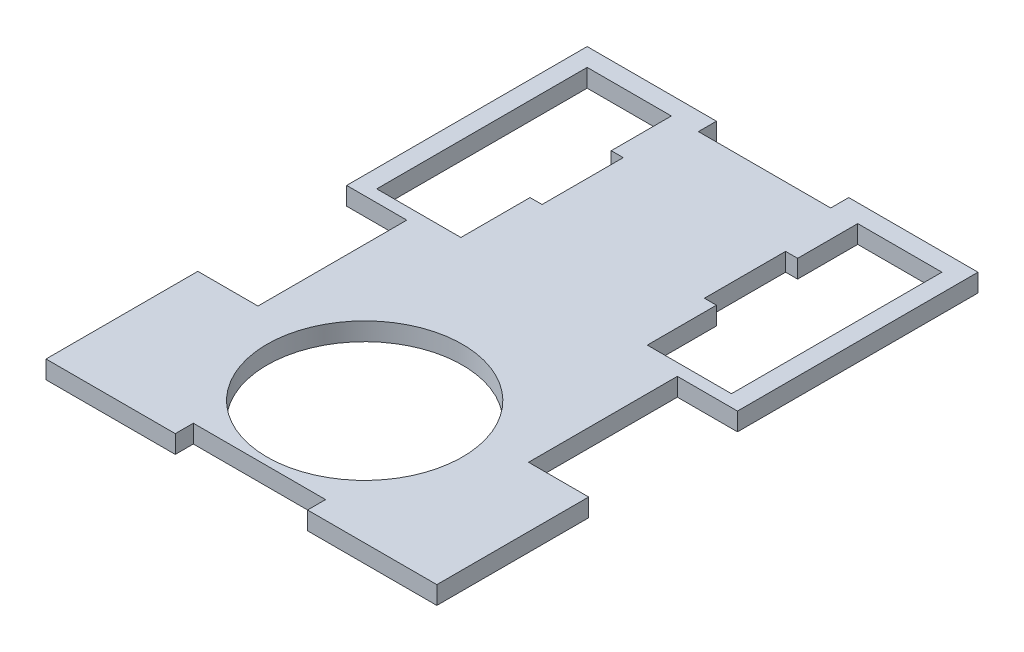
ISO-10303-21;
HEADER;
FILE_DESCRIPTION(('STEP AP214'),'2;1');
FILE_NAME('part.step','',(''),(''),'','','');
FILE_SCHEMA(('AUTOMOTIVE_DESIGN { 1 0 10303 214 1 1 1 1 }'));
ENDSEC;
DATA;
#1=APPLICATION_CONTEXT('core data for automotive mechanical design processes');
#2=APPLICATION_PROTOCOL_DEFINITION('international standard','automotive_design',2000,#1);
#3=PRODUCT_CONTEXT('',#1,'mechanical');
#4=PRODUCT('Part','Part','',(#3));
#5=PRODUCT_RELATED_PRODUCT_CATEGORY('part','',(#4));
#6=PRODUCT_DEFINITION_FORMATION('','',#4);
#7=PRODUCT_DEFINITION_CONTEXT('part definition',#1,'design');
#8=PRODUCT_DEFINITION('design','',#6,#7);
#9=PRODUCT_DEFINITION_SHAPE('','',#8);
#10=(LENGTH_UNIT() NAMED_UNIT(*) SI_UNIT(.MILLI.,.METRE.));
#11=(NAMED_UNIT(*) PLANE_ANGLE_UNIT() SI_UNIT($,.RADIAN.));
#12=(NAMED_UNIT(*) SI_UNIT($,.STERADIAN.) SOLID_ANGLE_UNIT());
#13=UNCERTAINTY_MEASURE_WITH_UNIT(LENGTH_MEASURE(1.E-05),#10,'distance_accuracy_value','');
#14=(GEOMETRIC_REPRESENTATION_CONTEXT(3) GLOBAL_UNCERTAINTY_ASSIGNED_CONTEXT((#13)) GLOBAL_UNIT_ASSIGNED_CONTEXT((#10,
#11,#12)) REPRESENTATION_CONTEXT('',''));
#15=CARTESIAN_POINT('',(0.,0.,0.));
#16=DIRECTION('',(0.,0.,1.));
#17=DIRECTION('',(1.,0.,0.));
#18=AXIS2_PLACEMENT_3D('',#15,#16,#17);
#19=CARTESIAN_POINT('',(0.,6.,0.));
#20=DIRECTION('',(0.,0.,-1.));
#21=DIRECTION('',(-1.,0.,0.));
#22=AXIS2_PLACEMENT_3D('',#19,#20,#21);
#23=PLANE('',#22);
#24=DIRECTION('',(0.,1.,0.));
#25=VECTOR('',#24,1.);
#26=CARTESIAN_POINT('',(43.,0.,0.));
#27=LINE('',#26,#25);
#28=CARTESIAN_POINT('',(43.,0.,0.));
#29=VERTEX_POINT('',#28);
#30=CARTESIAN_POINT('',(43.,6.,0.));
#31=VERTEX_POINT('',#30);
#32=EDGE_CURVE('E542',#29,#31,#27,.T.);
#33=ORIENTED_EDGE('',*,*,#32,.T.);
#34=DIRECTION('',(1.,0.,0.));
#35=VECTOR('',#34,1.);
#36=CARTESIAN_POINT('',(0.,6.,0.));
#37=LINE('',#36,#35);
#38=CARTESIAN_POINT('',(0.,6.,0.));
#39=VERTEX_POINT('',#38);
#40=EDGE_CURVE('E364',#39,#31,#37,.T.);
#41=ORIENTED_EDGE('',*,*,#40,.F.);
#42=DIRECTION('',(0.,-1.,0.));
#43=VECTOR('',#42,1.);
#44=CARTESIAN_POINT('',(0.,6.,0.));
#45=LINE('',#44,#43);
#46=CARTESIAN_POINT('',(0.,0.,0.));
#47=VERTEX_POINT('',#46);
#48=EDGE_CURVE('E11',#39,#47,#45,.T.);
#49=ORIENTED_EDGE('',*,*,#48,.T.);
#50=DIRECTION('',(1.,0.,0.));
#51=VECTOR('',#50,1.);
#52=CARTESIAN_POINT('',(0.,0.,0.));
#53=LINE('',#52,#51);
#54=EDGE_CURVE('E343',#47,#29,#53,.T.);
#55=ORIENTED_EDGE('',*,*,#54,.T.);
#56=EDGE_LOOP('',(#33,#41,#49,#55));
#57=FACE_BOUND('',#56,.T.);
#58=ADVANCED_FACE('F40',(#57),#23,.F.);
#59=CARTESIAN_POINT('',(0.,6.,-180.));
#60=DIRECTION('',(0.,0.,1.));
#61=DIRECTION('',(1.,0.,0.));
#62=AXIS2_PLACEMENT_3D('',#59,#60,#61);
#63=PLANE('',#62);
#64=DIRECTION('',(0.,1.,0.));
#65=VECTOR('',#64,1.);
#66=CARTESIAN_POINT('',(87.,0.,-180.));
#67=LINE('',#66,#65);
#68=CARTESIAN_POINT('',(87.,0.,-180.));
#69=VERTEX_POINT('',#68);
#70=CARTESIAN_POINT('',(87.,6.,-180.));
#71=VERTEX_POINT('',#70);
#72=EDGE_CURVE('E275',#69,#71,#67,.T.);
#73=ORIENTED_EDGE('',*,*,#72,.T.);
#74=DIRECTION('',(-1.,0.,0.));
#75=VECTOR('',#74,1.);
#76=CARTESIAN_POINT('',(0.,6.,-180.));
#77=LINE('',#76,#75);
#78=CARTESIAN_POINT('',(130.,6.,-180.));
#79=VERTEX_POINT('',#78);
#80=EDGE_CURVE('E318',#79,#71,#77,.T.);
#81=ORIENTED_EDGE('',*,*,#80,.F.);
#82=DIRECTION('',(0.,-1.,0.));
#83=VECTOR('',#82,1.);
#84=CARTESIAN_POINT('',(130.,6.,-180.));
#85=LINE('',#84,#83);
#86=CARTESIAN_POINT('',(130.,0.,-180.));
#87=VERTEX_POINT('',#86);
#88=EDGE_CURVE('E301',#79,#87,#85,.T.);
#89=ORIENTED_EDGE('',*,*,#88,.T.);
#90=DIRECTION('',(-1.,0.,0.));
#91=VECTOR('',#90,1.);
#92=CARTESIAN_POINT('',(0.,0.,-180.));
#93=LINE('',#92,#91);
#94=EDGE_CURVE('E292',#87,#69,#93,.T.);
#95=ORIENTED_EDGE('',*,*,#94,.T.);
#96=EDGE_LOOP('',(#73,#81,#89,#95));
#97=FACE_BOUND('',#96,.T.);
#98=ADVANCED_FACE('F299',(#97),#63,.F.);
#99=CARTESIAN_POINT('',(0.,6.,0.));
#100=DIRECTION('',(0.,-1.,0.));
#101=DIRECTION('',(0.,0.,-1.));
#102=AXIS2_PLACEMENT_3D('',#99,#100,#101);
#103=PLANE('',#102);
#104=CARTESIAN_POINT('',(64.9999999999999,6.,-41.));
#105=DIRECTION('',(0.,1.,0.));
#106=DIRECTION('',(0.,0.,1.));
#107=AXIS2_PLACEMENT_3D('',#104,#105,#106);
#108=CIRCLE('',#107,32.5);
#109=CARTESIAN_POINT('',(64.9999999999999,6.,-8.5));
#110=VERTEX_POINT('',#109);
#111=EDGE_CURVE('E435',#110,#110,#108,.T.);
#112=ORIENTED_EDGE('',*,*,#111,.F.);
#113=EDGE_LOOP('',(#112));
#114=FACE_BOUND('',#113,.T.);
#115=DIRECTION('',(0.,0.,1.));
#116=VECTOR('',#115,1.);
#117=CARTESIAN_POINT('',(38.,6.,0.));
#118=LINE('',#117,#116);
#119=CARTESIAN_POINT('',(38.,6.,-154.));
#120=VERTEX_POINT('',#119);
#121=CARTESIAN_POINT('',(38.,6.,-127.));
#122=VERTEX_POINT('',#121);
#123=EDGE_CURVE('E589',#120,#122,#118,.T.);
#124=ORIENTED_EDGE('',*,*,#123,.T.);
#125=DIRECTION('',(1.,0.,0.));
#126=VECTOR('',#125,1.);
#127=CARTESIAN_POINT('',(0.,6.,-127.));
#128=LINE('',#127,#126);
#129=CARTESIAN_POINT('',(34.,6.,-127.));
#130=VERTEX_POINT('',#129);
#131=EDGE_CURVE('E625',#130,#122,#128,.T.);
#132=ORIENTED_EDGE('',*,*,#131,.F.);
#133=DIRECTION('',(0.,0.,-1.));
#134=VECTOR('',#133,1.);
#135=CARTESIAN_POINT('',(34.,6.,-174.));
#136=LINE('',#135,#134);
#137=CARTESIAN_POINT('',(34.,6.,-104.));
#138=VERTEX_POINT('',#137);
#139=EDGE_CURVE('E441',#138,#130,#136,.T.);
#140=ORIENTED_EDGE('',*,*,#139,.F.);
#141=DIRECTION('',(1.,0.,0.));
#142=VECTOR('',#141,1.);
#143=CARTESIAN_POINT('',(5.99999999999995,6.,-104.));
#144=LINE('',#143,#142);
#145=CARTESIAN_POINT('',(5.99999999999995,6.,-104.));
#146=VERTEX_POINT('',#145);
#147=EDGE_CURVE('E446',#146,#138,#144,.T.);
#148=ORIENTED_EDGE('',*,*,#147,.F.);
#149=DIRECTION('',(0.,0.,1.));
#150=VECTOR('',#149,1.);
#151=CARTESIAN_POINT('',(5.99999999999994,6.,-174.));
#152=LINE('',#151,#150);
#153=CARTESIAN_POINT('',(5.99999999999994,6.,-174.));
#154=VERTEX_POINT('',#153);
#155=EDGE_CURVE('E386',#154,#146,#152,.T.);
#156=ORIENTED_EDGE('',*,*,#155,.F.);
#157=DIRECTION('',(-1.,0.,0.));
#158=VECTOR('',#157,1.);
#159=CARTESIAN_POINT('',(5.99999999999994,6.,-174.));
#160=LINE('',#159,#158);
#161=CARTESIAN_POINT('',(34.,6.,-174.));
#162=VERTEX_POINT('',#161);
#163=EDGE_CURVE('E436',#162,#154,#160,.T.);
#164=ORIENTED_EDGE('',*,*,#163,.F.);
#165=CARTESIAN_POINT('',(34.,6.,-154.));
#166=VERTEX_POINT('',#165);
#167=EDGE_CURVE('E445',#166,#162,#136,.T.);
#168=ORIENTED_EDGE('',*,*,#167,.F.);
#169=DIRECTION('',(1.,0.,0.));
#170=VECTOR('',#169,1.);
#171=CARTESIAN_POINT('',(0.,6.,-154.));
#172=LINE('',#171,#170);
#173=EDGE_CURVE('E630',#166,#120,#172,.T.);
#174=ORIENTED_EDGE('',*,*,#173,.T.);
#175=EDGE_LOOP('',(#124,#132,#140,#148,#156,#164,#168,#174));
#176=FACE_BOUND('',#175,.T.);
#177=DIRECTION('',(0.,0.,1.));
#178=VECTOR('',#177,1.);
#179=CARTESIAN_POINT('',(92.,6.,0.));
#180=LINE('',#179,#178);
#181=CARTESIAN_POINT('',(92.,6.,-154.));
#182=VERTEX_POINT('',#181);
#183=CARTESIAN_POINT('',(92.,6.,-127.));
#184=VERTEX_POINT('',#183);
#185=EDGE_CURVE('E595',#182,#184,#180,.T.);
#186=ORIENTED_EDGE('',*,*,#185,.F.);
#187=DIRECTION('',(-1.,0.,0.));
#188=VECTOR('',#187,1.);
#189=CARTESIAN_POINT('',(0.,6.,-154.));
#190=LINE('',#189,#188);
#191=CARTESIAN_POINT('',(96.,6.,-154.));
#192=VERTEX_POINT('',#191);
#193=EDGE_CURVE('E554',#192,#182,#190,.T.);
#194=ORIENTED_EDGE('',*,*,#193,.F.);
#195=DIRECTION('',(0.,0.,1.));
#196=VECTOR('',#195,1.);
#197=CARTESIAN_POINT('',(96.,6.,-174.));
#198=LINE('',#197,#196);
#199=CARTESIAN_POINT('',(96.,6.,-174.));
#200=VERTEX_POINT('',#199);
#201=EDGE_CURVE('E392',#200,#192,#198,.T.);
#202=ORIENTED_EDGE('',*,*,#201,.F.);
#203=DIRECTION('',(-1.,0.,0.));
#204=VECTOR('',#203,1.);
#205=CARTESIAN_POINT('',(124.,6.,-174.));
#206=LINE('',#205,#204);
#207=CARTESIAN_POINT('',(124.,6.,-174.));
#208=VERTEX_POINT('',#207);
#209=EDGE_CURVE('E397',#208,#200,#206,.T.);
#210=ORIENTED_EDGE('',*,*,#209,.F.);
#211=DIRECTION('',(0.,0.,-1.));
#212=VECTOR('',#211,1.);
#213=CARTESIAN_POINT('',(124.,6.,-174.));
#214=LINE('',#213,#212);
#215=CARTESIAN_POINT('',(124.,6.,-104.));
#216=VERTEX_POINT('',#215);
#217=EDGE_CURVE('E401',#216,#208,#214,.T.);
#218=ORIENTED_EDGE('',*,*,#217,.F.);
#219=DIRECTION('',(1.,0.,0.));
#220=VECTOR('',#219,1.);
#221=CARTESIAN_POINT('',(124.,6.,-104.));
#222=LINE('',#221,#220);
#223=CARTESIAN_POINT('',(96.,6.,-104.));
#224=VERTEX_POINT('',#223);
#225=EDGE_CURVE('E387',#224,#216,#222,.T.);
#226=ORIENTED_EDGE('',*,*,#225,.F.);
#227=CARTESIAN_POINT('',(96.,6.,-127.));
#228=VERTEX_POINT('',#227);
#229=EDGE_CURVE('E396',#228,#224,#198,.T.);
#230=ORIENTED_EDGE('',*,*,#229,.F.);
#231=DIRECTION('',(-1.,0.,0.));
#232=VECTOR('',#231,1.);
#233=CARTESIAN_POINT('',(0.,6.,-127.));
#234=LINE('',#233,#232);
#235=EDGE_CURVE('E590',#228,#184,#234,.T.);
#236=ORIENTED_EDGE('',*,*,#235,.T.);
#237=EDGE_LOOP('',(#186,#194,#202,#210,#218,#226,#230,#236));
#238=FACE_BOUND('',#237,.T.);
#239=DIRECTION('',(0.,0.,1.));
#240=VECTOR('',#239,1.);
#241=CARTESIAN_POINT('',(87.,6.,0.));
#242=LINE('',#241,#240);
#243=CARTESIAN_POINT('',(87.,6.,-174.));
#244=VERTEX_POINT('',#243);
#245=EDGE_CURVE('E280',#71,#244,#242,.T.);
#246=ORIENTED_EDGE('',*,*,#245,.T.);
#247=DIRECTION('',(1.,0.,0.));
#248=VECTOR('',#247,1.);
#249=CARTESIAN_POINT('',(0.,6.,-174.));
#250=LINE('',#249,#248);
#251=CARTESIAN_POINT('',(43.,6.,-174.));
#252=VERTEX_POINT('',#251);
#253=EDGE_CURVE('E296',#252,#244,#250,.T.);
#254=ORIENTED_EDGE('',*,*,#253,.F.);
#255=DIRECTION('',(0.,0.,1.));
#256=VECTOR('',#255,1.);
#257=CARTESIAN_POINT('',(43.,6.,0.));
#258=LINE('',#257,#256);
#259=CARTESIAN_POINT('',(43.,6.,-180.));
#260=VERTEX_POINT('',#259);
#261=EDGE_CURVE('E655',#260,#252,#258,.T.);
#262=ORIENTED_EDGE('',*,*,#261,.F.);
#263=CARTESIAN_POINT('',(0.,6.,-180.));
#264=VERTEX_POINT('',#263);
#265=EDGE_CURVE('E360',#260,#264,#77,.T.);
#266=ORIENTED_EDGE('',*,*,#265,.T.);
#267=DIRECTION('',(0.,0.,1.));
#268=VECTOR('',#267,1.);
#269=CARTESIAN_POINT('',(0.,6.,0.));
#270=LINE('',#269,#268);
#271=CARTESIAN_POINT('',(0.,6.,-100.));
#272=VERTEX_POINT('',#271);
#273=EDGE_CURVE('E308',#264,#272,#270,.T.);
#274=ORIENTED_EDGE('',*,*,#273,.T.);
#275=DIRECTION('',(-1.,0.,0.));
#276=VECTOR('',#275,1.);
#277=CARTESIAN_POINT('',(0.,6.,-100.));
#278=LINE('',#277,#276);
#279=CARTESIAN_POINT('',(19.9999999999999,6.,-100.));
#280=VERTEX_POINT('',#279);
#281=EDGE_CURVE('E489',#280,#272,#278,.T.);
#282=ORIENTED_EDGE('',*,*,#281,.F.);
#283=DIRECTION('',(0.,0.,-1.));
#284=VECTOR('',#283,1.);
#285=CARTESIAN_POINT('',(19.9999999999999,6.,-100.));
#286=LINE('',#285,#284);
#287=CARTESIAN_POINT('',(19.9999999999999,6.,-50.5));
#288=VERTEX_POINT('',#287);
#289=EDGE_CURVE('E493',#288,#280,#286,.T.);
#290=ORIENTED_EDGE('',*,*,#289,.F.);
#291=DIRECTION('',(1.,0.,0.));
#292=VECTOR('',#291,1.);
#293=CARTESIAN_POINT('',(0.,6.,-50.5));
#294=LINE('',#293,#292);
#295=CARTESIAN_POINT('',(0.,6.,-50.5));
#296=VERTEX_POINT('',#295);
#297=EDGE_CURVE('E497',#296,#288,#294,.T.);
#298=ORIENTED_EDGE('',*,*,#297,.F.);
#299=EDGE_CURVE('E303',#296,#39,#270,.T.);
#300=ORIENTED_EDGE('',*,*,#299,.T.);
#301=ORIENTED_EDGE('',*,*,#40,.T.);
#302=DIRECTION('',(0.,0.,-1.));
#303=VECTOR('',#302,1.);
#304=CARTESIAN_POINT('',(43.,6.,0.));
#305=LINE('',#304,#303);
#306=CARTESIAN_POINT('',(43.,6.,-5.99999999999999));
#307=VERTEX_POINT('',#306);
#308=EDGE_CURVE('E564',#31,#307,#305,.T.);
#309=ORIENTED_EDGE('',*,*,#308,.T.);
#310=DIRECTION('',(-1.,0.,0.));
#311=VECTOR('',#310,1.);
#312=CARTESIAN_POINT('',(0.,6.,-5.99999999999999));
#313=LINE('',#312,#311);
#314=CARTESIAN_POINT('',(87.,6.,-6.));
#315=VERTEX_POINT('',#314);
#316=EDGE_CURVE('E555',#315,#307,#313,.T.);
#317=ORIENTED_EDGE('',*,*,#316,.F.);
#318=DIRECTION('',(0.,0.,-1.));
#319=VECTOR('',#318,1.);
#320=CARTESIAN_POINT('',(87.,6.,0.));
#321=LINE('',#320,#319);
#322=CARTESIAN_POINT('',(87.,6.,0.));
#323=VERTEX_POINT('',#322);
#324=EDGE_CURVE('E560',#323,#315,#321,.T.);
#325=ORIENTED_EDGE('',*,*,#324,.F.);
#326=CARTESIAN_POINT('',(130.,6.,0.));
#327=VERTEX_POINT('',#326);
#328=EDGE_CURVE('E367',#323,#327,#37,.T.);
#329=ORIENTED_EDGE('',*,*,#328,.T.);
#330=DIRECTION('',(0.,0.,-1.));
#331=VECTOR('',#330,1.);
#332=CARTESIAN_POINT('',(130.,6.,0.));
#333=LINE('',#332,#331);
#334=CARTESIAN_POINT('',(130.,6.,-50.5));
#335=VERTEX_POINT('',#334);
#336=EDGE_CURVE('E330',#327,#335,#333,.T.);
#337=ORIENTED_EDGE('',*,*,#336,.T.);
#338=DIRECTION('',(1.,0.,0.));
#339=VECTOR('',#338,1.);
#340=CARTESIAN_POINT('',(130.,6.,-50.5));
#341=LINE('',#340,#339);
#342=CARTESIAN_POINT('',(110.,6.,-50.5));
#343=VERTEX_POINT('',#342);
#344=EDGE_CURVE('E523',#343,#335,#341,.T.);
#345=ORIENTED_EDGE('',*,*,#344,.F.);
#346=DIRECTION('',(0.,0.,1.));
#347=VECTOR('',#346,1.);
#348=CARTESIAN_POINT('',(110.,6.,-100.));
#349=LINE('',#348,#347);
#350=CARTESIAN_POINT('',(110.,6.,-100.));
#351=VERTEX_POINT('',#350);
#352=EDGE_CURVE('E527',#351,#343,#349,.T.);
#353=ORIENTED_EDGE('',*,*,#352,.F.);
#354=DIRECTION('',(-1.,0.,0.));
#355=VECTOR('',#354,1.);
#356=CARTESIAN_POINT('',(130.,6.,-100.));
#357=LINE('',#356,#355);
#358=CARTESIAN_POINT('',(130.,6.,-100.));
#359=VERTEX_POINT('',#358);
#360=EDGE_CURVE('E488',#359,#351,#357,.T.);
#361=ORIENTED_EDGE('',*,*,#360,.F.);
#362=EDGE_CURVE('E363',#359,#79,#333,.T.);
#363=ORIENTED_EDGE('',*,*,#362,.T.);
#364=ORIENTED_EDGE('',*,*,#80,.T.);
#365=EDGE_LOOP('',(#246,#254,#262,#266,#274,#282,#290,#298,#300,#301,#309,#317,#325,#329,#337,
#345,#353,#361,#363,#364));
#366=FACE_BOUND('',#365,.T.);
#367=ADVANCED_FACE('F680',(#114,#176,#238,#366),#103,.F.);
#368=CARTESIAN_POINT('',(0.,0.,0.));
#369=DIRECTION('',(0.,-1.,0.));
#370=DIRECTION('',(0.,0.,-1.));
#371=AXIS2_PLACEMENT_3D('',#368,#369,#370);
#372=PLANE('',#371);
#373=DIRECTION('',(1.,0.,0.));
#374=VECTOR('',#373,1.);
#375=CARTESIAN_POINT('',(0.,0.,-127.));
#376=LINE('',#375,#374);
#377=CARTESIAN_POINT('',(34.,0.,-127.));
#378=VERTEX_POINT('',#377);
#379=CARTESIAN_POINT('',(38.,0.,-127.));
#380=VERTEX_POINT('',#379);
#381=EDGE_CURVE('E615',#378,#380,#376,.T.);
#382=ORIENTED_EDGE('',*,*,#381,.T.);
#383=DIRECTION('',(0.,0.,1.));
#384=VECTOR('',#383,1.);
#385=CARTESIAN_POINT('',(38.,0.,0.));
#386=LINE('',#385,#384);
#387=CARTESIAN_POINT('',(38.,0.,-154.));
#388=VERTEX_POINT('',#387);
#389=EDGE_CURVE('E629',#388,#380,#386,.T.);
#390=ORIENTED_EDGE('',*,*,#389,.F.);
#391=DIRECTION('',(1.,0.,0.));
#392=VECTOR('',#391,1.);
#393=CARTESIAN_POINT('',(0.,0.,-154.));
#394=LINE('',#393,#392);
#395=CARTESIAN_POINT('',(34.,0.,-154.));
#396=VERTEX_POINT('',#395);
#397=EDGE_CURVE('E640',#396,#388,#394,.T.);
#398=ORIENTED_EDGE('',*,*,#397,.F.);
#399=DIRECTION('',(0.,0.,-1.));
#400=VECTOR('',#399,1.);
#401=CARTESIAN_POINT('',(34.,0.,-174.));
#402=LINE('',#401,#400);
#403=CARTESIAN_POINT('',(34.,0.,-174.));
#404=VERTEX_POINT('',#403);
#405=EDGE_CURVE('E459',#396,#404,#402,.T.);
#406=ORIENTED_EDGE('',*,*,#405,.T.);
#407=DIRECTION('',(-1.,0.,0.));
#408=VECTOR('',#407,1.);
#409=CARTESIAN_POINT('',(5.99999999999994,0.,-174.));
#410=LINE('',#409,#408);
#411=CARTESIAN_POINT('',(5.99999999999994,0.,-174.));
#412=VERTEX_POINT('',#411);
#413=EDGE_CURVE('E425',#404,#412,#410,.T.);
#414=ORIENTED_EDGE('',*,*,#413,.T.);
#415=DIRECTION('',(0.,0.,1.));
#416=VECTOR('',#415,1.);
#417=CARTESIAN_POINT('',(5.99999999999994,0.,-174.));
#418=LINE('',#417,#416);
#419=CARTESIAN_POINT('',(5.99999999999995,0.,-104.));
#420=VERTEX_POINT('',#419);
#421=EDGE_CURVE('E440',#412,#420,#418,.T.);
#422=ORIENTED_EDGE('',*,*,#421,.T.);
#423=DIRECTION('',(1.,0.,0.));
#424=VECTOR('',#423,1.);
#425=CARTESIAN_POINT('',(5.99999999999995,0.,-104.));
#426=LINE('',#425,#424);
#427=CARTESIAN_POINT('',(34.,0.,-104.));
#428=VERTEX_POINT('',#427);
#429=EDGE_CURVE('E460',#420,#428,#426,.T.);
#430=ORIENTED_EDGE('',*,*,#429,.T.);
#431=EDGE_CURVE('E455',#428,#378,#402,.T.);
#432=ORIENTED_EDGE('',*,*,#431,.T.);
#433=EDGE_LOOP('',(#382,#390,#398,#406,#414,#422,#430,#432));
#434=FACE_BOUND('',#433,.T.);
#435=DIRECTION('',(-1.,0.,0.));
#436=VECTOR('',#435,1.);
#437=CARTESIAN_POINT('',(0.,0.,-154.));
#438=LINE('',#437,#436);
#439=CARTESIAN_POINT('',(96.,0.,-154.));
#440=VERTEX_POINT('',#439);
#441=CARTESIAN_POINT('',(92.,0.,-154.));
#442=VERTEX_POINT('',#441);
#443=EDGE_CURVE('E594',#440,#442,#438,.T.);
#444=ORIENTED_EDGE('',*,*,#443,.T.);
#445=DIRECTION('',(0.,0.,1.));
#446=VECTOR('',#445,1.);
#447=CARTESIAN_POINT('',(92.,0.,0.));
#448=LINE('',#447,#446);
#449=CARTESIAN_POINT('',(92.,0.,-127.));
#450=VERTEX_POINT('',#449);
#451=EDGE_CURVE('E604',#442,#450,#448,.T.);
#452=ORIENTED_EDGE('',*,*,#451,.T.);
#453=DIRECTION('',(-1.,0.,0.));
#454=VECTOR('',#453,1.);
#455=CARTESIAN_POINT('',(0.,0.,-127.));
#456=LINE('',#455,#454);
#457=CARTESIAN_POINT('',(96.,0.,-127.));
#458=VERTEX_POINT('',#457);
#459=EDGE_CURVE('E579',#458,#450,#456,.T.);
#460=ORIENTED_EDGE('',*,*,#459,.F.);
#461=DIRECTION('',(0.,0.,1.));
#462=VECTOR('',#461,1.);
#463=CARTESIAN_POINT('',(96.,0.,-174.));
#464=LINE('',#463,#462);
#465=CARTESIAN_POINT('',(96.,0.,-104.));
#466=VERTEX_POINT('',#465);
#467=EDGE_CURVE('E412',#458,#466,#464,.T.);
#468=ORIENTED_EDGE('',*,*,#467,.T.);
#469=DIRECTION('',(1.,0.,0.));
#470=VECTOR('',#469,1.);
#471=CARTESIAN_POINT('',(124.,0.,-104.));
#472=LINE('',#471,#470);
#473=CARTESIAN_POINT('',(124.,0.,-104.));
#474=VERTEX_POINT('',#473);
#475=EDGE_CURVE('E376',#466,#474,#472,.T.);
#476=ORIENTED_EDGE('',*,*,#475,.T.);
#477=DIRECTION('',(0.,0.,-1.));
#478=VECTOR('',#477,1.);
#479=CARTESIAN_POINT('',(124.,0.,-174.));
#480=LINE('',#479,#478);
#481=CARTESIAN_POINT('',(124.,0.,-174.));
#482=VERTEX_POINT('',#481);
#483=EDGE_CURVE('E391',#474,#482,#480,.T.);
#484=ORIENTED_EDGE('',*,*,#483,.T.);
#485=DIRECTION('',(-1.,0.,0.));
#486=VECTOR('',#485,1.);
#487=CARTESIAN_POINT('',(124.,0.,-174.));
#488=LINE('',#487,#486);
#489=CARTESIAN_POINT('',(96.,0.,-174.));
#490=VERTEX_POINT('',#489);
#491=EDGE_CURVE('E413',#482,#490,#488,.T.);
#492=ORIENTED_EDGE('',*,*,#491,.T.);
#493=EDGE_CURVE('E408',#490,#440,#464,.T.);
#494=ORIENTED_EDGE('',*,*,#493,.T.);
#495=EDGE_LOOP('',(#444,#452,#460,#468,#476,#484,#492,#494));
#496=FACE_BOUND('',#495,.T.);
#497=CARTESIAN_POINT('',(64.9999999999999,0.,-41.));
#498=DIRECTION('',(0.,1.,0.));
#499=DIRECTION('',(0.,0.,1.));
#500=AXIS2_PLACEMENT_3D('',#497,#498,#499);
#501=CIRCLE('',#500,32.5);
#502=CARTESIAN_POINT('',(64.9999999999999,0.,-8.5));
#503=VERTEX_POINT('',#502);
#504=EDGE_CURVE('E470',#503,#503,#501,.T.);
#505=ORIENTED_EDGE('',*,*,#504,.T.);
#506=EDGE_LOOP('',(#505));
#507=FACE_BOUND('',#506,.T.);
#508=DIRECTION('',(1.,0.,0.));
#509=VECTOR('',#508,1.);
#510=CARTESIAN_POINT('',(0.,0.,-174.));
#511=LINE('',#510,#509);
#512=CARTESIAN_POINT('',(43.,0.,-174.));
#513=VERTEX_POINT('',#512);
#514=CARTESIAN_POINT('',(87.,0.,-174.));
#515=VERTEX_POINT('',#514);
#516=EDGE_CURVE('E56',#513,#515,#511,.T.);
#517=ORIENTED_EDGE('',*,*,#516,.T.);
#518=DIRECTION('',(0.,0.,1.));
#519=VECTOR('',#518,1.);
#520=CARTESIAN_POINT('',(87.,0.,0.));
#521=LINE('',#520,#519);
#522=EDGE_CURVE('E278',#69,#515,#521,.T.);
#523=ORIENTED_EDGE('',*,*,#522,.F.);
#524=ORIENTED_EDGE('',*,*,#94,.F.);
#525=DIRECTION('',(0.,0.,-1.));
#526=VECTOR('',#525,1.);
#527=CARTESIAN_POINT('',(130.,0.,0.));
#528=LINE('',#527,#526);
#529=CARTESIAN_POINT('',(130.,0.,-100.));
#530=VERTEX_POINT('',#529);
#531=EDGE_CURVE('E341',#530,#87,#528,.T.);
#532=ORIENTED_EDGE('',*,*,#531,.F.);
#533=DIRECTION('',(-1.,0.,0.));
#534=VECTOR('',#533,1.);
#535=CARTESIAN_POINT('',(130.,0.,-100.));
#536=LINE('',#535,#534);
#537=CARTESIAN_POINT('',(110.,0.,-100.));
#538=VERTEX_POINT('',#537);
#539=EDGE_CURVE('E526',#530,#538,#536,.T.);
#540=ORIENTED_EDGE('',*,*,#539,.T.);
#541=DIRECTION('',(0.,0.,1.));
#542=VECTOR('',#541,1.);
#543=CARTESIAN_POINT('',(110.,0.,-100.));
#544=LINE('',#543,#542);
#545=CARTESIAN_POINT('',(110.,0.,-50.5));
#546=VERTEX_POINT('',#545);
#547=EDGE_CURVE('E536',#538,#546,#544,.T.);
#548=ORIENTED_EDGE('',*,*,#547,.T.);
#549=DIRECTION('',(1.,0.,0.));
#550=VECTOR('',#549,1.);
#551=CARTESIAN_POINT('',(130.,0.,-50.5));
#552=LINE('',#551,#550);
#553=CARTESIAN_POINT('',(130.,0.,-50.5));
#554=VERTEX_POINT('',#553);
#555=EDGE_CURVE('E339',#546,#554,#552,.T.);
#556=ORIENTED_EDGE('',*,*,#555,.T.);
#557=CARTESIAN_POINT('',(130.,0.,0.));
#558=VERTEX_POINT('',#557);
#559=EDGE_CURVE('E310',#558,#554,#528,.T.);
#560=ORIENTED_EDGE('',*,*,#559,.F.);
#561=CARTESIAN_POINT('',(87.,0.,0.));
#562=VERTEX_POINT('',#561);
#563=EDGE_CURVE('E336',#562,#558,#53,.T.);
#564=ORIENTED_EDGE('',*,*,#563,.F.);
#565=DIRECTION('',(0.,0.,-1.));
#566=VECTOR('',#565,1.);
#567=CARTESIAN_POINT('',(87.,0.,0.));
#568=LINE('',#567,#566);
#569=CARTESIAN_POINT('',(87.,0.,-6.));
#570=VERTEX_POINT('',#569);
#571=EDGE_CURVE('E570',#562,#570,#568,.T.);
#572=ORIENTED_EDGE('',*,*,#571,.T.);
#573=DIRECTION('',(-1.,0.,0.));
#574=VECTOR('',#573,1.);
#575=CARTESIAN_POINT('',(0.,0.,-5.99999999999999));
#576=LINE('',#575,#574);
#577=CARTESIAN_POINT('',(43.,0.,-5.99999999999999));
#578=VERTEX_POINT('',#577);
#579=EDGE_CURVE('E64',#570,#578,#576,.T.);
#580=ORIENTED_EDGE('',*,*,#579,.T.);
#581=DIRECTION('',(0.,0.,-1.));
#582=VECTOR('',#581,1.);
#583=CARTESIAN_POINT('',(43.,0.,0.));
#584=LINE('',#583,#582);
#585=EDGE_CURVE('E559',#29,#578,#584,.T.);
#586=ORIENTED_EDGE('',*,*,#585,.F.);
#587=ORIENTED_EDGE('',*,*,#54,.F.);
#588=DIRECTION('',(0.,0.,1.));
#589=VECTOR('',#588,1.);
#590=CARTESIAN_POINT('',(0.,0.,0.));
#591=LINE('',#590,#589);
#592=CARTESIAN_POINT('',(0.,0.,-50.5));
#593=VERTEX_POINT('',#592);
#594=EDGE_CURVE('E357',#593,#47,#591,.T.);
#595=ORIENTED_EDGE('',*,*,#594,.F.);
#596=DIRECTION('',(1.,0.,0.));
#597=VECTOR('',#596,1.);
#598=CARTESIAN_POINT('',(0.,0.,-50.5));
#599=LINE('',#598,#597);
#600=CARTESIAN_POINT('',(19.9999999999999,0.,-50.5));
#601=VERTEX_POINT('',#600);
#602=EDGE_CURVE('E492',#593,#601,#599,.T.);
#603=ORIENTED_EDGE('',*,*,#602,.T.);
#604=DIRECTION('',(0.,0.,-1.));
#605=VECTOR('',#604,1.);
#606=CARTESIAN_POINT('',(19.9999999999999,0.,-100.));
#607=LINE('',#606,#605);
#608=CARTESIAN_POINT('',(19.9999999999999,0.,-100.));
#609=VERTEX_POINT('',#608);
#610=EDGE_CURVE('E505',#601,#609,#607,.T.);
#611=ORIENTED_EDGE('',*,*,#610,.T.);
#612=DIRECTION('',(-1.,0.,0.));
#613=VECTOR('',#612,1.);
#614=CARTESIAN_POINT('',(0.,0.,-100.));
#615=LINE('',#614,#613);
#616=CARTESIAN_POINT('',(0.,0.,-100.));
#617=VERTEX_POINT('',#616);
#618=EDGE_CURVE('E478',#609,#617,#615,.T.);
#619=ORIENTED_EDGE('',*,*,#618,.T.);
#620=CARTESIAN_POINT('',(0.,0.,-180.));
#621=VERTEX_POINT('',#620);
#622=EDGE_CURVE('E352',#621,#617,#591,.T.);
#623=ORIENTED_EDGE('',*,*,#622,.F.);
#624=CARTESIAN_POINT('',(43.,0.,-180.));
#625=VERTEX_POINT('',#624);
#626=EDGE_CURVE('E304',#625,#621,#93,.T.);
#627=ORIENTED_EDGE('',*,*,#626,.F.);
#628=DIRECTION('',(0.,0.,1.));
#629=VECTOR('',#628,1.);
#630=CARTESIAN_POINT('',(43.,0.,0.));
#631=LINE('',#630,#629);
#632=EDGE_CURVE('E295',#625,#513,#631,.T.);
#633=ORIENTED_EDGE('',*,*,#632,.T.);
#634=EDGE_LOOP('',(#517,#523,#524,#532,#540,#548,#556,#560,#564,#572,#580,#586,#587,#595,#603,
#611,#619,#623,#627,#633));
#635=FACE_BOUND('',#634,.T.);
#636=ADVANCED_FACE('F290',(#434,#496,#507,#635),#372,.T.);
#637=CARTESIAN_POINT('',(96.,0.,-174.));
#638=DIRECTION('',(-1.,0.,0.));
#639=DIRECTION('',(0.,0.,1.));
#640=AXIS2_PLACEMENT_3D('',#637,#638,#639);
#641=PLANE('',#640);
#642=DIRECTION('',(0.,1.,0.));
#643=VECTOR('',#642,1.);
#644=CARTESIAN_POINT('',(96.,0.,-127.));
#645=LINE('',#644,#643);
#646=EDGE_CURVE('E582',#458,#228,#645,.T.);
#647=ORIENTED_EDGE('',*,*,#646,.T.);
#648=ORIENTED_EDGE('',*,*,#229,.T.);
#649=DIRECTION('',(0.,1.,0.));
#650=VECTOR('',#649,1.);
#651=CARTESIAN_POINT('',(96.,0.,-104.));
#652=LINE('',#651,#650);
#653=EDGE_CURVE('E379',#466,#224,#652,.T.);
#654=ORIENTED_EDGE('',*,*,#653,.F.);
#655=ORIENTED_EDGE('',*,*,#467,.F.);
#656=EDGE_LOOP('',(#647,#648,#654,#655));
#657=FACE_BOUND('',#656,.T.);
#658=ADVANCED_FACE('F705',(#657),#641,.F.);
#659=CARTESIAN_POINT('',(34.,0.,-174.));
#660=DIRECTION('',(1.,0.,0.));
#661=DIRECTION('',(0.,0.,-1.));
#662=AXIS2_PLACEMENT_3D('',#659,#660,#661);
#663=PLANE('',#662);
#664=DIRECTION('',(0.,1.,0.));
#665=VECTOR('',#664,1.);
#666=CARTESIAN_POINT('',(34.,0.,-154.));
#667=LINE('',#666,#665);
#668=EDGE_CURVE('E614',#396,#166,#667,.T.);
#669=ORIENTED_EDGE('',*,*,#668,.T.);
#670=ORIENTED_EDGE('',*,*,#167,.T.);
#671=DIRECTION('',(0.,1.,0.));
#672=VECTOR('',#671,1.);
#673=CARTESIAN_POINT('',(34.,0.,-174.));
#674=LINE('',#673,#672);
#675=EDGE_CURVE('E428',#404,#162,#674,.T.);
#676=ORIENTED_EDGE('',*,*,#675,.F.);
#677=ORIENTED_EDGE('',*,*,#405,.F.);
#678=EDGE_LOOP('',(#669,#670,#676,#677));
#679=FACE_BOUND('',#678,.T.);
#680=ADVANCED_FACE('F771',(#679),#663,.F.);
#681=CARTESIAN_POINT('',(0.,6.,0.));
#682=DIRECTION('',(1.,0.,0.));
#683=DIRECTION('',(0.,0.,-1.));
#684=AXIS2_PLACEMENT_3D('',#681,#682,#683);
#685=PLANE('',#684);
#686=ORIENTED_EDGE('',*,*,#622,.T.);
#687=DIRECTION('',(0.,1.,0.));
#688=VECTOR('',#687,1.);
#689=CARTESIAN_POINT('',(0.,0.,-100.));
#690=LINE('',#689,#688);
#691=EDGE_CURVE('E484',#617,#272,#690,.T.);
#692=ORIENTED_EDGE('',*,*,#691,.T.);
#693=ORIENTED_EDGE('',*,*,#273,.F.);
#694=DIRECTION('',(0.,-1.,0.));
#695=VECTOR('',#694,1.);
#696=CARTESIAN_POINT('',(0.,6.,-180.));
#697=LINE('',#696,#695);
#698=EDGE_CURVE('E314',#264,#621,#697,.T.);
#699=ORIENTED_EDGE('',*,*,#698,.T.);
#700=EDGE_LOOP('',(#686,#692,#693,#699));
#701=FACE_BOUND('',#700,.T.);
#702=ADVANCED_FACE('F766',(#701),#685,.F.);
#703=CARTESIAN_POINT('',(130.,6.,0.));
#704=DIRECTION('',(-1.,0.,0.));
#705=DIRECTION('',(0.,0.,1.));
#706=AXIS2_PLACEMENT_3D('',#703,#704,#705);
#707=PLANE('',#706);
#708=ORIENTED_EDGE('',*,*,#559,.T.);
#709=DIRECTION('',(0.,1.,0.));
#710=VECTOR('',#709,1.);
#711=CARTESIAN_POINT('',(130.,0.,-50.5));
#712=LINE('',#711,#710);
#713=EDGE_CURVE('E404',#554,#335,#712,.T.);
#714=ORIENTED_EDGE('',*,*,#713,.T.);
#715=ORIENTED_EDGE('',*,*,#336,.F.);
#716=DIRECTION('',(0.,-1.,0.));
#717=VECTOR('',#716,1.);
#718=CARTESIAN_POINT('',(130.,6.,0.));
#719=LINE('',#718,#717);
#720=EDGE_CURVE('E49',#327,#558,#719,.T.);
#721=ORIENTED_EDGE('',*,*,#720,.T.);
#722=EDGE_LOOP('',(#708,#714,#715,#721));
#723=FACE_BOUND('',#722,.T.);
#724=ADVANCED_FACE('F327',(#723),#707,.F.);
#725=ORIENTED_EDGE('',*,*,#299,.F.);
#726=DIRECTION('',(0.,1.,0.));
#727=VECTOR('',#726,1.);
#728=CARTESIAN_POINT('',(0.,0.,-50.5));
#729=LINE('',#728,#727);
#730=EDGE_CURVE('E474',#593,#296,#729,.T.);
#731=ORIENTED_EDGE('',*,*,#730,.F.);
#732=ORIENTED_EDGE('',*,*,#594,.T.);
#733=ORIENTED_EDGE('',*,*,#48,.F.);
#734=EDGE_LOOP('',(#725,#731,#732,#733));
#735=FACE_BOUND('',#734,.T.);
#736=ADVANCED_FACE('F42',(#735),#685,.F.);
#737=ORIENTED_EDGE('',*,*,#328,.F.);
#738=DIRECTION('',(0.,1.,0.));
#739=VECTOR('',#738,1.);
#740=CARTESIAN_POINT('',(87.,0.,0.));
#741=LINE('',#740,#739);
#742=EDGE_CURVE('E545',#562,#323,#741,.T.);
#743=ORIENTED_EDGE('',*,*,#742,.F.);
#744=ORIENTED_EDGE('',*,*,#563,.T.);
#745=ORIENTED_EDGE('',*,*,#720,.F.);
#746=EDGE_LOOP('',(#737,#743,#744,#745));
#747=FACE_BOUND('',#746,.T.);
#748=ADVANCED_FACE('F684',(#747),#23,.F.);
#749=ORIENTED_EDGE('',*,*,#362,.F.);
#750=DIRECTION('',(0.,1.,0.));
#751=VECTOR('',#750,1.);
#752=CARTESIAN_POINT('',(130.,0.,-100.));
#753=LINE('',#752,#751);
#754=EDGE_CURVE('E512',#530,#359,#753,.T.);
#755=ORIENTED_EDGE('',*,*,#754,.F.);
#756=ORIENTED_EDGE('',*,*,#531,.T.);
#757=ORIENTED_EDGE('',*,*,#88,.F.);
#758=EDGE_LOOP('',(#749,#755,#756,#757));
#759=FACE_BOUND('',#758,.T.);
#760=ADVANCED_FACE('F759',(#759),#707,.F.);
#761=ORIENTED_EDGE('',*,*,#265,.F.);
#762=DIRECTION('',(0.,1.,0.));
#763=VECTOR('',#762,1.);
#764=CARTESIAN_POINT('',(43.,0.,-180.));
#765=LINE('',#764,#763);
#766=EDGE_CURVE('E286',#625,#260,#765,.T.);
#767=ORIENTED_EDGE('',*,*,#766,.F.);
#768=ORIENTED_EDGE('',*,*,#626,.T.);
#769=ORIENTED_EDGE('',*,*,#698,.F.);
#770=EDGE_LOOP('',(#761,#767,#768,#769));
#771=FACE_BOUND('',#770,.T.);
#772=ADVANCED_FACE('F672',(#771),#63,.F.);
#773=CARTESIAN_POINT('',(124.,0.,-174.));
#774=DIRECTION('',(1.,0.,0.));
#775=DIRECTION('',(0.,0.,-1.));
#776=AXIS2_PLACEMENT_3D('',#773,#774,#775);
#777=PLANE('',#776);
#778=ORIENTED_EDGE('',*,*,#217,.T.);
#779=DIRECTION('',(0.,1.,0.));
#780=VECTOR('',#779,1.);
#781=CARTESIAN_POINT('',(124.,0.,-174.));
#782=LINE('',#781,#780);
#783=EDGE_CURVE('E371',#482,#208,#782,.T.);
#784=ORIENTED_EDGE('',*,*,#783,.F.);
#785=ORIENTED_EDGE('',*,*,#483,.F.);
#786=DIRECTION('',(0.,1.,0.));
#787=VECTOR('',#786,1.);
#788=CARTESIAN_POINT('',(124.,0.,-104.));
#789=LINE('',#788,#787);
#790=EDGE_CURVE('E383',#474,#216,#789,.T.);
#791=ORIENTED_EDGE('',*,*,#790,.T.);
#792=EDGE_LOOP('',(#778,#784,#785,#791));
#793=FACE_BOUND('',#792,.T.);
#794=ADVANCED_FACE('F717',(#793),#777,.F.);
#795=CARTESIAN_POINT('',(124.,0.,-104.));
#796=DIRECTION('',(0.,0.,1.));
#797=DIRECTION('',(1.,0.,0.));
#798=AXIS2_PLACEMENT_3D('',#795,#796,#797);
#799=PLANE('',#798);
#800=ORIENTED_EDGE('',*,*,#225,.T.);
#801=ORIENTED_EDGE('',*,*,#790,.F.);
#802=ORIENTED_EDGE('',*,*,#475,.F.);
#803=ORIENTED_EDGE('',*,*,#653,.T.);
#804=EDGE_LOOP('',(#800,#801,#802,#803));
#805=FACE_BOUND('',#804,.T.);
#806=ADVANCED_FACE('F711',(#805),#799,.F.);
#807=ORIENTED_EDGE('',*,*,#201,.T.);
#808=DIRECTION('',(0.,1.,0.));
#809=VECTOR('',#808,1.);
#810=CARTESIAN_POINT('',(96.,0.,-154.));
#811=LINE('',#810,#809);
#812=EDGE_CURVE('E586',#440,#192,#811,.T.);
#813=ORIENTED_EDGE('',*,*,#812,.F.);
#814=ORIENTED_EDGE('',*,*,#493,.F.);
#815=DIRECTION('',(0.,1.,0.));
#816=VECTOR('',#815,1.);
#817=CARTESIAN_POINT('',(96.,0.,-174.));
#818=LINE('',#817,#816);
#819=EDGE_CURVE('E375',#490,#200,#818,.T.);
#820=ORIENTED_EDGE('',*,*,#819,.T.);
#821=EDGE_LOOP('',(#807,#813,#814,#820));
#822=FACE_BOUND('',#821,.T.);
#823=ADVANCED_FACE('F736',(#822),#641,.F.);
#824=CARTESIAN_POINT('',(124.,0.,-174.));
#825=DIRECTION('',(0.,0.,-1.));
#826=DIRECTION('',(-1.,0.,0.));
#827=AXIS2_PLACEMENT_3D('',#824,#825,#826);
#828=PLANE('',#827);
#829=ORIENTED_EDGE('',*,*,#209,.T.);
#830=ORIENTED_EDGE('',*,*,#819,.F.);
#831=ORIENTED_EDGE('',*,*,#491,.F.);
#832=ORIENTED_EDGE('',*,*,#783,.T.);
#833=EDGE_LOOP('',(#829,#830,#831,#832));
#834=FACE_BOUND('',#833,.T.);
#835=ADVANCED_FACE('F721',(#834),#828,.F.);
#836=CARTESIAN_POINT('',(5.99999999999994,0.,-174.));
#837=DIRECTION('',(-1.,0.,0.));
#838=DIRECTION('',(0.,0.,1.));
#839=AXIS2_PLACEMENT_3D('',#836,#837,#838);
#840=PLANE('',#839);
#841=ORIENTED_EDGE('',*,*,#155,.T.);
#842=DIRECTION('',(0.,1.,0.));
#843=VECTOR('',#842,1.);
#844=CARTESIAN_POINT('',(5.99999999999995,0.,-104.));
#845=LINE('',#844,#843);
#846=EDGE_CURVE('E420',#420,#146,#845,.T.);
#847=ORIENTED_EDGE('',*,*,#846,.F.);
#848=ORIENTED_EDGE('',*,*,#421,.F.);
#849=DIRECTION('',(0.,1.,0.));
#850=VECTOR('',#849,1.);
#851=CARTESIAN_POINT('',(5.99999999999994,0.,-174.));
#852=LINE('',#851,#850);
#853=EDGE_CURVE('E432',#412,#154,#852,.T.);
#854=ORIENTED_EDGE('',*,*,#853,.T.);
#855=EDGE_LOOP('',(#841,#847,#848,#854));
#856=FACE_BOUND('',#855,.T.);
#857=ADVANCED_FACE('F810',(#856),#840,.F.);
#858=CARTESIAN_POINT('',(5.99999999999994,0.,-174.));
#859=DIRECTION('',(0.,0.,-1.));
#860=DIRECTION('',(-1.,0.,0.));
#861=AXIS2_PLACEMENT_3D('',#858,#859,#860);
#862=PLANE('',#861);
#863=ORIENTED_EDGE('',*,*,#163,.T.);
#864=ORIENTED_EDGE('',*,*,#853,.F.);
#865=ORIENTED_EDGE('',*,*,#413,.F.);
#866=ORIENTED_EDGE('',*,*,#675,.T.);
#867=EDGE_LOOP('',(#863,#864,#865,#866));
#868=FACE_BOUND('',#867,.T.);
#869=ADVANCED_FACE('F808',(#868),#862,.F.);
#870=ORIENTED_EDGE('',*,*,#139,.T.);
#871=DIRECTION('',(0.,1.,0.));
#872=VECTOR('',#871,1.);
#873=CARTESIAN_POINT('',(34.,0.,-127.));
#874=LINE('',#873,#872);
#875=EDGE_CURVE('E619',#378,#130,#874,.T.);
#876=ORIENTED_EDGE('',*,*,#875,.F.);
#877=ORIENTED_EDGE('',*,*,#431,.F.);
#878=DIRECTION('',(0.,1.,0.));
#879=VECTOR('',#878,1.);
#880=CARTESIAN_POINT('',(34.,0.,-104.));
#881=LINE('',#880,#879);
#882=EDGE_CURVE('E424',#428,#138,#881,.T.);
#883=ORIENTED_EDGE('',*,*,#882,.T.);
#884=EDGE_LOOP('',(#870,#876,#877,#883));
#885=FACE_BOUND('',#884,.T.);
#886=ADVANCED_FACE('F778',(#885),#663,.F.);
#887=CARTESIAN_POINT('',(5.99999999999995,0.,-104.));
#888=DIRECTION('',(0.,0.,1.));
#889=DIRECTION('',(1.,0.,0.));
#890=AXIS2_PLACEMENT_3D('',#887,#888,#889);
#891=PLANE('',#890);
#892=ORIENTED_EDGE('',*,*,#147,.T.);
#893=ORIENTED_EDGE('',*,*,#882,.F.);
#894=ORIENTED_EDGE('',*,*,#429,.F.);
#895=ORIENTED_EDGE('',*,*,#846,.T.);
#896=EDGE_LOOP('',(#892,#893,#894,#895));
#897=FACE_BOUND('',#896,.T.);
#898=ADVANCED_FACE('F806',(#897),#891,.F.);
#899=CARTESIAN_POINT('',(64.9999999999999,0.,-41.));
#900=DIRECTION('',(0.,1.,0.));
#901=DIRECTION('',(0.,0.,1.));
#902=AXIS2_PLACEMENT_3D('',#899,#900,#901);
#903=CYLINDRICAL_SURFACE('',#902,32.5);
#904=ORIENTED_EDGE('',*,*,#504,.F.);
#905=EDGE_LOOP('',(#904));
#906=FACE_BOUND('',#905,.T.);
#907=ORIENTED_EDGE('',*,*,#111,.T.);
#908=EDGE_LOOP('',(#907));
#909=FACE_BOUND('',#908,.T.);
#910=ADVANCED_FACE('F803',(#906,#909),#903,.F.);
#911=CARTESIAN_POINT('',(0.,0.,-100.));
#912=DIRECTION('',(0.,0.,-1.));
#913=DIRECTION('',(-1.,0.,0.));
#914=AXIS2_PLACEMENT_3D('',#911,#912,#913);
#915=PLANE('',#914);
#916=ORIENTED_EDGE('',*,*,#281,.T.);
#917=ORIENTED_EDGE('',*,*,#691,.F.);
#918=ORIENTED_EDGE('',*,*,#618,.F.);
#919=DIRECTION('',(0.,1.,0.));
#920=VECTOR('',#919,1.);
#921=CARTESIAN_POINT('',(19.9999999999999,0.,-100.));
#922=LINE('',#921,#920);
#923=EDGE_CURVE('E481',#609,#280,#922,.T.);
#924=ORIENTED_EDGE('',*,*,#923,.T.);
#925=EDGE_LOOP('',(#916,#917,#918,#924));
#926=FACE_BOUND('',#925,.T.);
#927=ADVANCED_FACE('F781',(#926),#915,.F.);
#928=CARTESIAN_POINT('',(19.9999999999999,0.,-100.));
#929=DIRECTION('',(1.,0.,0.));
#930=DIRECTION('',(0.,0.,-1.));
#931=AXIS2_PLACEMENT_3D('',#928,#929,#930);
#932=PLANE('',#931);
#933=ORIENTED_EDGE('',*,*,#289,.T.);
#934=ORIENTED_EDGE('',*,*,#923,.F.);
#935=ORIENTED_EDGE('',*,*,#610,.F.);
#936=DIRECTION('',(0.,1.,0.));
#937=VECTOR('',#936,1.);
#938=CARTESIAN_POINT('',(19.9999999999999,0.,-50.5));
#939=LINE('',#938,#937);
#940=EDGE_CURVE('E477',#601,#288,#939,.T.);
#941=ORIENTED_EDGE('',*,*,#940,.T.);
#942=EDGE_LOOP('',(#933,#934,#935,#941));
#943=FACE_BOUND('',#942,.T.);
#944=ADVANCED_FACE('F786',(#943),#932,.F.);
#945=CARTESIAN_POINT('',(0.,0.,-50.5));
#946=DIRECTION('',(0.,0.,1.));
#947=DIRECTION('',(1.,0.,0.));
#948=AXIS2_PLACEMENT_3D('',#945,#946,#947);
#949=PLANE('',#948);
#950=ORIENTED_EDGE('',*,*,#297,.T.);
#951=ORIENTED_EDGE('',*,*,#940,.F.);
#952=ORIENTED_EDGE('',*,*,#602,.F.);
#953=ORIENTED_EDGE('',*,*,#730,.T.);
#954=EDGE_LOOP('',(#950,#951,#952,#953));
#955=FACE_BOUND('',#954,.T.);
#956=ADVANCED_FACE('F789',(#955),#949,.F.);
#957=CARTESIAN_POINT('',(130.,0.,-50.5));
#958=DIRECTION('',(0.,0.,1.));
#959=DIRECTION('',(1.,0.,0.));
#960=AXIS2_PLACEMENT_3D('',#957,#958,#959);
#961=PLANE('',#960);
#962=ORIENTED_EDGE('',*,*,#344,.T.);
#963=ORIENTED_EDGE('',*,*,#713,.F.);
#964=ORIENTED_EDGE('',*,*,#555,.F.);
#965=DIRECTION('',(0.,1.,0.));
#966=VECTOR('',#965,1.);
#967=CARTESIAN_POINT('',(110.,0.,-50.5));
#968=LINE('',#967,#966);
#969=EDGE_CURVE('E518',#546,#343,#968,.T.);
#970=ORIENTED_EDGE('',*,*,#969,.T.);
#971=EDGE_LOOP('',(#962,#963,#964,#970));
#972=FACE_BOUND('',#971,.T.);
#973=ADVANCED_FACE('F791',(#972),#961,.F.);
#974=CARTESIAN_POINT('',(110.,0.,-100.));
#975=DIRECTION('',(-1.,0.,0.));
#976=DIRECTION('',(0.,0.,1.));
#977=AXIS2_PLACEMENT_3D('',#974,#975,#976);
#978=PLANE('',#977);
#979=ORIENTED_EDGE('',*,*,#352,.T.);
#980=ORIENTED_EDGE('',*,*,#969,.F.);
#981=ORIENTED_EDGE('',*,*,#547,.F.);
#982=DIRECTION('',(0.,1.,0.));
#983=VECTOR('',#982,1.);
#984=CARTESIAN_POINT('',(110.,0.,-100.));
#985=LINE('',#984,#983);
#986=EDGE_CURVE('E515',#538,#351,#985,.T.);
#987=ORIENTED_EDGE('',*,*,#986,.T.);
#988=EDGE_LOOP('',(#979,#980,#981,#987));
#989=FACE_BOUND('',#988,.T.);
#990=ADVANCED_FACE('F797',(#989),#978,.F.);
#991=CARTESIAN_POINT('',(130.,0.,-100.));
#992=DIRECTION('',(0.,0.,-1.));
#993=DIRECTION('',(-1.,0.,0.));
#994=AXIS2_PLACEMENT_3D('',#991,#992,#993);
#995=PLANE('',#994);
#996=ORIENTED_EDGE('',*,*,#360,.T.);
#997=ORIENTED_EDGE('',*,*,#986,.F.);
#998=ORIENTED_EDGE('',*,*,#539,.F.);
#999=ORIENTED_EDGE('',*,*,#754,.T.);
#1000=EDGE_LOOP('',(#996,#997,#998,#999));
#1001=FACE_BOUND('',#1000,.T.);
#1002=ADVANCED_FACE('F853',(#1001),#995,.F.);
#1003=CARTESIAN_POINT('',(38.,0.,0.));
#1004=DIRECTION('',(-1.,0.,0.));
#1005=DIRECTION('',(0.,0.,1.));
#1006=AXIS2_PLACEMENT_3D('',#1003,#1004,#1005);
#1007=PLANE('',#1006);
#1008=ORIENTED_EDGE('',*,*,#123,.F.);
#1009=DIRECTION('',(0.,1.,0.));
#1010=VECTOR('',#1009,1.);
#1011=CARTESIAN_POINT('',(38.,0.,-154.));
#1012=LINE('',#1011,#1010);
#1013=EDGE_CURVE('E611',#388,#120,#1012,.T.);
#1014=ORIENTED_EDGE('',*,*,#1013,.F.);
#1015=ORIENTED_EDGE('',*,*,#389,.T.);
#1016=DIRECTION('',(0.,1.,0.));
#1017=VECTOR('',#1016,1.);
#1018=CARTESIAN_POINT('',(38.,0.,-127.));
#1019=LINE('',#1018,#1017);
#1020=EDGE_CURVE('E622',#380,#122,#1019,.T.);
#1021=ORIENTED_EDGE('',*,*,#1020,.T.);
#1022=EDGE_LOOP('',(#1008,#1014,#1015,#1021));
#1023=FACE_BOUND('',#1022,.T.);
#1024=ADVANCED_FACE('F848',(#1023),#1007,.T.);
#1025=CARTESIAN_POINT('',(0.,0.,-127.));
#1026=DIRECTION('',(0.,0.,1.));
#1027=DIRECTION('',(1.,0.,0.));
#1028=AXIS2_PLACEMENT_3D('',#1025,#1026,#1027);
#1029=PLANE('',#1028);
#1030=ORIENTED_EDGE('',*,*,#131,.T.);
#1031=ORIENTED_EDGE('',*,*,#1020,.F.);
#1032=ORIENTED_EDGE('',*,*,#381,.F.);
#1033=ORIENTED_EDGE('',*,*,#875,.T.);
#1034=EDGE_LOOP('',(#1030,#1031,#1032,#1033));
#1035=FACE_BOUND('',#1034,.T.);
#1036=ADVANCED_FACE('F746',(#1035),#1029,.F.);
#1037=CARTESIAN_POINT('',(0.,0.,-154.));
#1038=DIRECTION('',(0.,0.,1.));
#1039=DIRECTION('',(1.,0.,0.));
#1040=AXIS2_PLACEMENT_3D('',#1037,#1038,#1039);
#1041=PLANE('',#1040);
#1042=ORIENTED_EDGE('',*,*,#173,.F.);
#1043=ORIENTED_EDGE('',*,*,#668,.F.);
#1044=ORIENTED_EDGE('',*,*,#397,.T.);
#1045=ORIENTED_EDGE('',*,*,#1013,.T.);
#1046=EDGE_LOOP('',(#1042,#1043,#1044,#1045));
#1047=FACE_BOUND('',#1046,.T.);
#1048=ADVANCED_FACE('F739',(#1047),#1041,.T.);
#1049=CARTESIAN_POINT('',(0.,0.,-154.));
#1050=DIRECTION('',(0.,0.,-1.));
#1051=DIRECTION('',(-1.,0.,0.));
#1052=AXIS2_PLACEMENT_3D('',#1049,#1050,#1051);
#1053=PLANE('',#1052);
#1054=ORIENTED_EDGE('',*,*,#193,.T.);
#1055=DIRECTION('',(0.,1.,0.));
#1056=VECTOR('',#1055,1.);
#1057=CARTESIAN_POINT('',(92.,0.,-154.));
#1058=LINE('',#1057,#1056);
#1059=EDGE_CURVE('E575',#442,#182,#1058,.T.);
#1060=ORIENTED_EDGE('',*,*,#1059,.F.);
#1061=ORIENTED_EDGE('',*,*,#443,.F.);
#1062=ORIENTED_EDGE('',*,*,#812,.T.);
#1063=EDGE_LOOP('',(#1054,#1060,#1061,#1062));
#1064=FACE_BOUND('',#1063,.T.);
#1065=ADVANCED_FACE('F737',(#1064),#1053,.F.);
#1066=CARTESIAN_POINT('',(0.,0.,-127.));
#1067=DIRECTION('',(0.,0.,-1.));
#1068=DIRECTION('',(-1.,0.,0.));
#1069=AXIS2_PLACEMENT_3D('',#1066,#1067,#1068);
#1070=PLANE('',#1069);
#1071=ORIENTED_EDGE('',*,*,#235,.F.);
#1072=ORIENTED_EDGE('',*,*,#646,.F.);
#1073=ORIENTED_EDGE('',*,*,#459,.T.);
#1074=DIRECTION('',(0.,1.,0.));
#1075=VECTOR('',#1074,1.);
#1076=CARTESIAN_POINT('',(92.,0.,-127.));
#1077=LINE('',#1076,#1075);
#1078=EDGE_CURVE('E578',#450,#184,#1077,.T.);
#1079=ORIENTED_EDGE('',*,*,#1078,.T.);
#1080=EDGE_LOOP('',(#1071,#1072,#1073,#1079));
#1081=FACE_BOUND('',#1080,.T.);
#1082=ADVANCED_FACE('F729',(#1081),#1070,.T.);
#1083=CARTESIAN_POINT('',(92.,0.,0.));
#1084=DIRECTION('',(-1.,0.,0.));
#1085=DIRECTION('',(0.,0.,1.));
#1086=AXIS2_PLACEMENT_3D('',#1083,#1084,#1085);
#1087=PLANE('',#1086);
#1088=ORIENTED_EDGE('',*,*,#185,.T.);
#1089=ORIENTED_EDGE('',*,*,#1078,.F.);
#1090=ORIENTED_EDGE('',*,*,#451,.F.);
#1091=ORIENTED_EDGE('',*,*,#1059,.T.);
#1092=EDGE_LOOP('',(#1088,#1089,#1090,#1091));
#1093=FACE_BOUND('',#1092,.T.);
#1094=ADVANCED_FACE('F731',(#1093),#1087,.F.);
#1095=CARTESIAN_POINT('',(43.,0.,0.));
#1096=DIRECTION('',(1.,0.,0.));
#1097=DIRECTION('',(0.,0.,-1.));
#1098=AXIS2_PLACEMENT_3D('',#1095,#1096,#1097);
#1099=PLANE('',#1098);
#1100=ORIENTED_EDGE('',*,*,#308,.F.);
#1101=ORIENTED_EDGE('',*,*,#32,.F.);
#1102=ORIENTED_EDGE('',*,*,#585,.T.);
#1103=DIRECTION('',(0.,1.,0.));
#1104=VECTOR('',#1103,1.);
#1105=CARTESIAN_POINT('',(43.,0.,-5.99999999999999));
#1106=LINE('',#1105,#1104);
#1107=EDGE_CURVE('E551',#578,#307,#1106,.T.);
#1108=ORIENTED_EDGE('',*,*,#1107,.T.);
#1109=EDGE_LOOP('',(#1100,#1101,#1102,#1108));
#1110=FACE_BOUND('',#1109,.T.);
#1111=ADVANCED_FACE('F690',(#1110),#1099,.T.);
#1112=CARTESIAN_POINT('',(0.,0.,-5.99999999999999));
#1113=DIRECTION('',(0.,0.,-1.));
#1114=DIRECTION('',(-1.,0.,0.));
#1115=AXIS2_PLACEMENT_3D('',#1112,#1113,#1114);
#1116=PLANE('',#1115);
#1117=ORIENTED_EDGE('',*,*,#316,.T.);
#1118=ORIENTED_EDGE('',*,*,#1107,.F.);
#1119=ORIENTED_EDGE('',*,*,#579,.F.);
#1120=DIRECTION('',(0.,1.,0.));
#1121=VECTOR('',#1120,1.);
#1122=CARTESIAN_POINT('',(87.,0.,-6.));
#1123=LINE('',#1122,#1121);
#1124=EDGE_CURVE('E548',#570,#315,#1123,.T.);
#1125=ORIENTED_EDGE('',*,*,#1124,.T.);
#1126=EDGE_LOOP('',(#1117,#1118,#1119,#1125));
#1127=FACE_BOUND('',#1126,.T.);
#1128=ADVANCED_FACE('F691',(#1127),#1116,.F.);
#1129=CARTESIAN_POINT('',(87.,0.,0.));
#1130=DIRECTION('',(1.,0.,0.));
#1131=DIRECTION('',(0.,0.,-1.));
#1132=AXIS2_PLACEMENT_3D('',#1129,#1130,#1131);
#1133=PLANE('',#1132);
#1134=ORIENTED_EDGE('',*,*,#324,.T.);
#1135=ORIENTED_EDGE('',*,*,#1124,.F.);
#1136=ORIENTED_EDGE('',*,*,#571,.F.);
#1137=ORIENTED_EDGE('',*,*,#742,.T.);
#1138=EDGE_LOOP('',(#1134,#1135,#1136,#1137));
#1139=FACE_BOUND('',#1138,.T.);
#1140=ADVANCED_FACE('F686',(#1139),#1133,.F.);
#1141=CARTESIAN_POINT('',(87.,0.,0.));
#1142=DIRECTION('',(-1.,0.,0.));
#1143=DIRECTION('',(0.,0.,1.));
#1144=AXIS2_PLACEMENT_3D('',#1141,#1142,#1143);
#1145=PLANE('',#1144);
#1146=ORIENTED_EDGE('',*,*,#245,.F.);
#1147=ORIENTED_EDGE('',*,*,#72,.F.);
#1148=ORIENTED_EDGE('',*,*,#522,.T.);
#1149=DIRECTION('',(0.,1.,0.));
#1150=VECTOR('',#1149,1.);
#1151=CARTESIAN_POINT('',(87.,0.,-174.));
#1152=LINE('',#1151,#1150);
#1153=EDGE_CURVE('E501',#515,#244,#1152,.T.);
#1154=ORIENTED_EDGE('',*,*,#1153,.T.);
#1155=EDGE_LOOP('',(#1146,#1147,#1148,#1154));
#1156=FACE_BOUND('',#1155,.T.);
#1157=ADVANCED_FACE('F277',(#1156),#1145,.T.);
#1158=CARTESIAN_POINT('',(0.,0.,-174.));
#1159=DIRECTION('',(0.,0.,1.));
#1160=DIRECTION('',(1.,0.,0.));
#1161=AXIS2_PLACEMENT_3D('',#1158,#1159,#1160);
#1162=PLANE('',#1161);
#1163=ORIENTED_EDGE('',*,*,#253,.T.);
#1164=ORIENTED_EDGE('',*,*,#1153,.F.);
#1165=ORIENTED_EDGE('',*,*,#516,.F.);
#1166=DIRECTION('',(0.,1.,0.));
#1167=VECTOR('',#1166,1.);
#1168=CARTESIAN_POINT('',(43.,0.,-174.));
#1169=LINE('',#1168,#1167);
#1170=EDGE_CURVE('E647',#513,#252,#1169,.T.);
#1171=ORIENTED_EDGE('',*,*,#1170,.T.);
#1172=EDGE_LOOP('',(#1163,#1164,#1165,#1171));
#1173=FACE_BOUND('',#1172,.T.);
#1174=ADVANCED_FACE('F922',(#1173),#1162,.F.);
#1175=CARTESIAN_POINT('',(43.,0.,0.));
#1176=DIRECTION('',(-1.,0.,0.));
#1177=DIRECTION('',(0.,0.,1.));
#1178=AXIS2_PLACEMENT_3D('',#1175,#1176,#1177);
#1179=PLANE('',#1178);
#1180=ORIENTED_EDGE('',*,*,#261,.T.);
#1181=ORIENTED_EDGE('',*,*,#1170,.F.);
#1182=ORIENTED_EDGE('',*,*,#632,.F.);
#1183=ORIENTED_EDGE('',*,*,#766,.T.);
#1184=EDGE_LOOP('',(#1180,#1181,#1182,#1183));
#1185=FACE_BOUND('',#1184,.T.);
#1186=ADVANCED_FACE('F668',(#1185),#1179,.F.);
#1187=CLOSED_SHELL('',(#58,#98,#367,#636,#658,#680,#702,#724,#736,#748,#760,#772,#794,#806,#823,
#835,#857,#869,#886,#898,#910,#927,#944,#956,#973,#990,#1002,#1024,#1036,#1048,#1065,#1082,
#1094,#1111,#1128,#1140,#1157,#1174,#1186));
#1188=MANIFOLD_SOLID_BREP('B2',#1187);
#1189=ADVANCED_BREP_SHAPE_REPRESENTATION('',(#18,#1188),#14);
#1190=SHAPE_DEFINITION_REPRESENTATION(#9,#1189);
ENDSEC;
END-ISO-10303-21;
